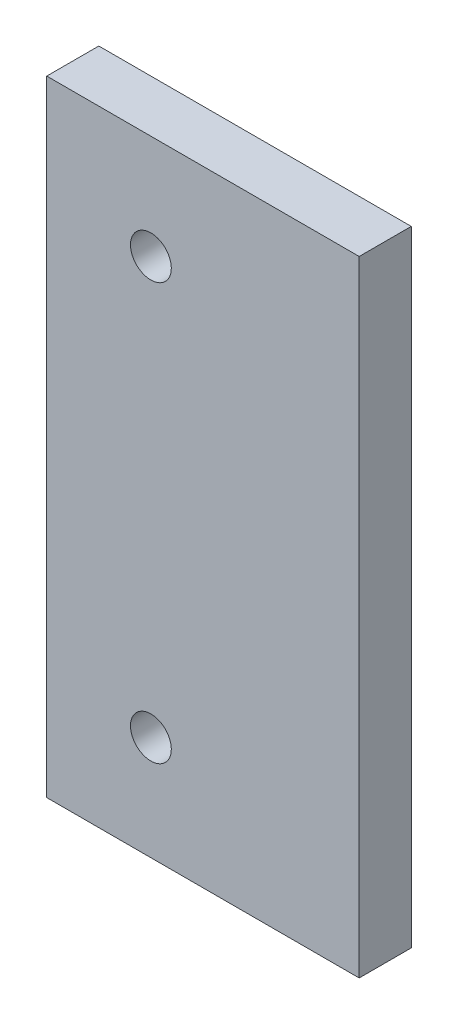
ISO-10303-21;
HEADER;
FILE_DESCRIPTION(('STEP AP214'),'2;1');
FILE_NAME('part.step','',(''),(''),'','','');
FILE_SCHEMA(('AUTOMOTIVE_DESIGN { 1 0 10303 214 1 1 1 1 }'));
ENDSEC;
DATA;
#1=APPLICATION_CONTEXT('core data for automotive mechanical design processes');
#2=APPLICATION_PROTOCOL_DEFINITION('international standard','automotive_design',2000,#1);
#3=PRODUCT_CONTEXT('',#1,'mechanical');
#4=PRODUCT('Part','Part','',(#3));
#5=PRODUCT_RELATED_PRODUCT_CATEGORY('part','',(#4));
#6=PRODUCT_DEFINITION_FORMATION('','',#4);
#7=PRODUCT_DEFINITION_CONTEXT('part definition',#1,'design');
#8=PRODUCT_DEFINITION('design','',#6,#7);
#9=PRODUCT_DEFINITION_SHAPE('','',#8);
#10=(LENGTH_UNIT() NAMED_UNIT(*) SI_UNIT(.MILLI.,.METRE.));
#11=(NAMED_UNIT(*) PLANE_ANGLE_UNIT() SI_UNIT($,.RADIAN.));
#12=(NAMED_UNIT(*) SI_UNIT($,.STERADIAN.) SOLID_ANGLE_UNIT());
#13=UNCERTAINTY_MEASURE_WITH_UNIT(LENGTH_MEASURE(1.E-05),#10,'distance_accuracy_value','');
#14=(GEOMETRIC_REPRESENTATION_CONTEXT(3) GLOBAL_UNCERTAINTY_ASSIGNED_CONTEXT((#13)) GLOBAL_UNIT_ASSIGNED_CONTEXT((#10,
#11,#12)) REPRESENTATION_CONTEXT('',''));
#15=CARTESIAN_POINT('',(0.,0.,0.));
#16=DIRECTION('',(0.,0.,1.));
#17=DIRECTION('',(1.,0.,0.));
#18=AXIS2_PLACEMENT_3D('',#15,#16,#17);
#19=CARTESIAN_POINT('',(0.,0.,3.175));
#20=DIRECTION('',(0.,0.,-1.));
#21=DIRECTION('',(-1.,0.,0.));
#22=AXIS2_PLACEMENT_3D('',#19,#20,#21);
#23=PLANE('',#22);
#24=DIRECTION('',(0.,-1.,0.));
#25=VECTOR('',#24,1.);
#26=CARTESIAN_POINT('',(-19.05,-38.1,3.175));
#27=LINE('',#26,#25);
#28=CARTESIAN_POINT('',(-19.05,38.1,3.175));
#29=VERTEX_POINT('',#28);
#30=CARTESIAN_POINT('',(-19.05,-38.1,3.175));
#31=VERTEX_POINT('',#30);
#32=EDGE_CURVE('E94',#29,#31,#27,.T.);
#33=ORIENTED_EDGE('',*,*,#32,.T.);
#34=DIRECTION('',(1.,0.,0.));
#35=VECTOR('',#34,1.);
#36=CARTESIAN_POINT('',(-19.05,-38.1,3.175));
#37=LINE('',#36,#35);
#38=CARTESIAN_POINT('',(19.05,-38.1,3.175));
#39=VERTEX_POINT('',#38);
#40=EDGE_CURVE('E89',#31,#39,#37,.T.);
#41=ORIENTED_EDGE('',*,*,#40,.T.);
#42=DIRECTION('',(0.,1.,0.));
#43=VECTOR('',#42,1.);
#44=CARTESIAN_POINT('',(19.05,-38.1,3.175));
#45=LINE('',#44,#43);
#46=CARTESIAN_POINT('',(19.05,38.1,3.175));
#47=VERTEX_POINT('',#46);
#48=EDGE_CURVE('E92',#39,#47,#45,.T.);
#49=ORIENTED_EDGE('',*,*,#48,.T.);
#50=DIRECTION('',(-1.,0.,0.));
#51=VECTOR('',#50,1.);
#52=CARTESIAN_POINT('',(-19.05,38.1,3.175));
#53=LINE('',#52,#51);
#54=EDGE_CURVE('E59',#47,#29,#53,.T.);
#55=ORIENTED_EDGE('',*,*,#54,.T.);
#56=EDGE_LOOP('',(#33,#41,#49,#55));
#57=FACE_BOUND('',#56,.T.);
#58=CARTESIAN_POINT('',(-6.34999999999999,25.4,3.175));
#59=DIRECTION('',(0.,0.,1.));
#60=DIRECTION('',(1.,0.,0.));
#61=AXIS2_PLACEMENT_3D('',#58,#59,#60);
#62=CIRCLE('',#61,2.4892);
#63=CARTESIAN_POINT('',(-3.86079999999999,25.4,3.175));
#64=VERTEX_POINT('',#63);
#65=EDGE_CURVE('E114',#64,#64,#62,.T.);
#66=ORIENTED_EDGE('',*,*,#65,.F.);
#67=EDGE_LOOP('',(#66));
#68=FACE_BOUND('',#67,.T.);
#69=CARTESIAN_POINT('',(-6.34999999999999,-25.4,3.175));
#70=DIRECTION('',(0.,0.,1.));
#71=DIRECTION('',(1.,0.,0.));
#72=AXIS2_PLACEMENT_3D('',#69,#70,#71);
#73=CIRCLE('',#72,2.4892);
#74=CARTESIAN_POINT('',(-3.86079999999999,-25.4,3.175));
#75=VERTEX_POINT('',#74);
#76=EDGE_CURVE('E136',#75,#75,#73,.T.);
#77=ORIENTED_EDGE('',*,*,#76,.F.);
#78=EDGE_LOOP('',(#77));
#79=FACE_BOUND('',#78,.T.);
#80=ADVANCED_FACE('F41',(#57,#68,#79),#23,.F.);
#81=CARTESIAN_POINT('',(0.,0.,-3.175));
#82=DIRECTION('',(0.,0.,-1.));
#83=DIRECTION('',(-1.,0.,0.));
#84=AXIS2_PLACEMENT_3D('',#81,#82,#83);
#85=PLANE('',#84);
#86=CARTESIAN_POINT('',(-6.34999999999999,25.4,-3.175));
#87=DIRECTION('',(0.,0.,1.));
#88=DIRECTION('',(1.,0.,0.));
#89=AXIS2_PLACEMENT_3D('',#86,#87,#88);
#90=CIRCLE('',#89,2.4892);
#91=CARTESIAN_POINT('',(-3.86079999999999,25.4,-3.175));
#92=VERTEX_POINT('',#91);
#93=EDGE_CURVE('E132',#92,#92,#90,.T.);
#94=ORIENTED_EDGE('',*,*,#93,.T.);
#95=EDGE_LOOP('',(#94));
#96=FACE_BOUND('',#95,.T.);
#97=DIRECTION('',(0.,-1.,0.));
#98=VECTOR('',#97,1.);
#99=CARTESIAN_POINT('',(-19.05,-38.1,-3.175));
#100=LINE('',#99,#98);
#101=CARTESIAN_POINT('',(-19.05,38.1,-3.175));
#102=VERTEX_POINT('',#101);
#103=CARTESIAN_POINT('',(-19.05,-38.1,-3.175));
#104=VERTEX_POINT('',#103);
#105=EDGE_CURVE('E110',#102,#104,#100,.T.);
#106=ORIENTED_EDGE('',*,*,#105,.F.);
#107=DIRECTION('',(-1.,0.,0.));
#108=VECTOR('',#107,1.);
#109=CARTESIAN_POINT('',(-19.05,38.1,-3.175));
#110=LINE('',#109,#108);
#111=CARTESIAN_POINT('',(19.05,38.1,-3.175));
#112=VERTEX_POINT('',#111);
#113=EDGE_CURVE('E82',#112,#102,#110,.T.);
#114=ORIENTED_EDGE('',*,*,#113,.F.);
#115=DIRECTION('',(0.,1.,0.));
#116=VECTOR('',#115,1.);
#117=CARTESIAN_POINT('',(19.05,-38.1,-3.175));
#118=LINE('',#117,#116);
#119=CARTESIAN_POINT('',(19.05,-38.1,-3.175));
#120=VERTEX_POINT('',#119);
#121=EDGE_CURVE('E76',#120,#112,#118,.T.);
#122=ORIENTED_EDGE('',*,*,#121,.F.);
#123=DIRECTION('',(1.,0.,0.));
#124=VECTOR('',#123,1.);
#125=CARTESIAN_POINT('',(-19.05,-38.1,-3.175));
#126=LINE('',#125,#124);
#127=EDGE_CURVE('E99',#104,#120,#126,.T.);
#128=ORIENTED_EDGE('',*,*,#127,.F.);
#129=EDGE_LOOP('',(#106,#114,#122,#128));
#130=FACE_BOUND('',#129,.T.);
#131=CARTESIAN_POINT('',(-6.34999999999999,-25.4,-3.175));
#132=DIRECTION('',(0.,0.,1.));
#133=DIRECTION('',(1.,0.,0.));
#134=AXIS2_PLACEMENT_3D('',#131,#132,#133);
#135=CIRCLE('',#134,2.4892);
#136=CARTESIAN_POINT('',(-3.86079999999999,-25.4,-3.175));
#137=VERTEX_POINT('',#136);
#138=EDGE_CURVE('E140',#137,#137,#135,.T.);
#139=ORIENTED_EDGE('',*,*,#138,.T.);
#140=EDGE_LOOP('',(#139));
#141=FACE_BOUND('',#140,.T.);
#142=ADVANCED_FACE('F127',(#96,#130,#141),#85,.T.);
#143=CARTESIAN_POINT('',(-19.05,-38.1,3.175));
#144=DIRECTION('',(1.,0.,0.));
#145=DIRECTION('',(0.,0.,-1.));
#146=AXIS2_PLACEMENT_3D('',#143,#144,#145);
#147=PLANE('',#146);
#148=ORIENTED_EDGE('',*,*,#105,.T.);
#149=DIRECTION('',(0.,0.,-1.));
#150=VECTOR('',#149,1.);
#151=CARTESIAN_POINT('',(-19.05,-38.1,3.175));
#152=LINE('',#151,#150);
#153=EDGE_CURVE('E11',#31,#104,#152,.T.);
#154=ORIENTED_EDGE('',*,*,#153,.F.);
#155=ORIENTED_EDGE('',*,*,#32,.F.);
#156=DIRECTION('',(0.,0.,-1.));
#157=VECTOR('',#156,1.);
#158=CARTESIAN_POINT('',(-19.05,38.1,3.175));
#159=LINE('',#158,#157);
#160=EDGE_CURVE('E106',#29,#102,#159,.T.);
#161=ORIENTED_EDGE('',*,*,#160,.T.);
#162=EDGE_LOOP('',(#148,#154,#155,#161));
#163=FACE_BOUND('',#162,.T.);
#164=ADVANCED_FACE('F43',(#163),#147,.F.);
#165=CARTESIAN_POINT('',(-19.05,-38.1,3.175));
#166=DIRECTION('',(0.,1.,0.));
#167=DIRECTION('',(0.,0.,1.));
#168=AXIS2_PLACEMENT_3D('',#165,#166,#167);
#169=PLANE('',#168);
#170=ORIENTED_EDGE('',*,*,#127,.T.);
#171=DIRECTION('',(0.,0.,-1.));
#172=VECTOR('',#171,1.);
#173=CARTESIAN_POINT('',(19.05,-38.1,3.175));
#174=LINE('',#173,#172);
#175=EDGE_CURVE('E51',#39,#120,#174,.T.);
#176=ORIENTED_EDGE('',*,*,#175,.F.);
#177=ORIENTED_EDGE('',*,*,#40,.F.);
#178=ORIENTED_EDGE('',*,*,#153,.T.);
#179=EDGE_LOOP('',(#170,#176,#177,#178));
#180=FACE_BOUND('',#179,.T.);
#181=ADVANCED_FACE('F98',(#180),#169,.F.);
#182=CARTESIAN_POINT('',(19.05,-38.1,3.175));
#183=DIRECTION('',(-1.,0.,0.));
#184=DIRECTION('',(0.,-1.,0.));
#185=AXIS2_PLACEMENT_3D('',#182,#183,#184);
#186=PLANE('',#185);
#187=ORIENTED_EDGE('',*,*,#121,.T.);
#188=DIRECTION('',(0.,0.,-1.));
#189=VECTOR('',#188,1.);
#190=CARTESIAN_POINT('',(19.05,38.1,3.175));
#191=LINE('',#190,#189);
#192=EDGE_CURVE('E101',#47,#112,#191,.T.);
#193=ORIENTED_EDGE('',*,*,#192,.F.);
#194=ORIENTED_EDGE('',*,*,#48,.F.);
#195=ORIENTED_EDGE('',*,*,#175,.T.);
#196=EDGE_LOOP('',(#187,#193,#194,#195));
#197=FACE_BOUND('',#196,.T.);
#198=ADVANCED_FACE('F102',(#197),#186,.F.);
#199=CARTESIAN_POINT('',(-19.05,38.1,3.175));
#200=DIRECTION('',(0.,-1.,0.));
#201=DIRECTION('',(0.,0.,-1.));
#202=AXIS2_PLACEMENT_3D('',#199,#200,#201);
#203=PLANE('',#202);
#204=ORIENTED_EDGE('',*,*,#113,.T.);
#205=ORIENTED_EDGE('',*,*,#160,.F.);
#206=ORIENTED_EDGE('',*,*,#54,.F.);
#207=ORIENTED_EDGE('',*,*,#192,.T.);
#208=EDGE_LOOP('',(#204,#205,#206,#207));
#209=FACE_BOUND('',#208,.T.);
#210=ADVANCED_FACE('F124',(#209),#203,.F.);
#211=CARTESIAN_POINT('',(-6.34999999999999,25.4,3.175));
#212=DIRECTION('',(0.,0.,-1.));
#213=DIRECTION('',(-1.,0.,0.));
#214=AXIS2_PLACEMENT_3D('',#211,#212,#213);
#215=CYLINDRICAL_SURFACE('',#214,2.4892);
#216=ORIENTED_EDGE('',*,*,#65,.T.);
#217=EDGE_LOOP('',(#216));
#218=FACE_BOUND('',#217,.T.);
#219=ORIENTED_EDGE('',*,*,#93,.F.);
#220=EDGE_LOOP('',(#219));
#221=FACE_BOUND('',#220,.T.);
#222=ADVANCED_FACE('F159',(#218,#221),#215,.F.);
#223=CARTESIAN_POINT('',(-6.34999999999999,-25.4,3.175));
#224=DIRECTION('',(0.,0.,-1.));
#225=DIRECTION('',(-1.,0.,0.));
#226=AXIS2_PLACEMENT_3D('',#223,#224,#225);
#227=CYLINDRICAL_SURFACE('',#226,2.4892);
#228=ORIENTED_EDGE('',*,*,#76,.T.);
#229=EDGE_LOOP('',(#228));
#230=FACE_BOUND('',#229,.T.);
#231=ORIENTED_EDGE('',*,*,#138,.F.);
#232=EDGE_LOOP('',(#231));
#233=FACE_BOUND('',#232,.T.);
#234=ADVANCED_FACE('F148',(#230,#233),#227,.F.);
#235=CLOSED_SHELL('',(#80,#142,#164,#181,#198,#210,#222,#234));
#236=MANIFOLD_SOLID_BREP('B2',#235);
#237=ADVANCED_BREP_SHAPE_REPRESENTATION('',(#18,#236),#14);
#238=SHAPE_DEFINITION_REPRESENTATION(#9,#237);
ENDSEC;
END-ISO-10303-21;
